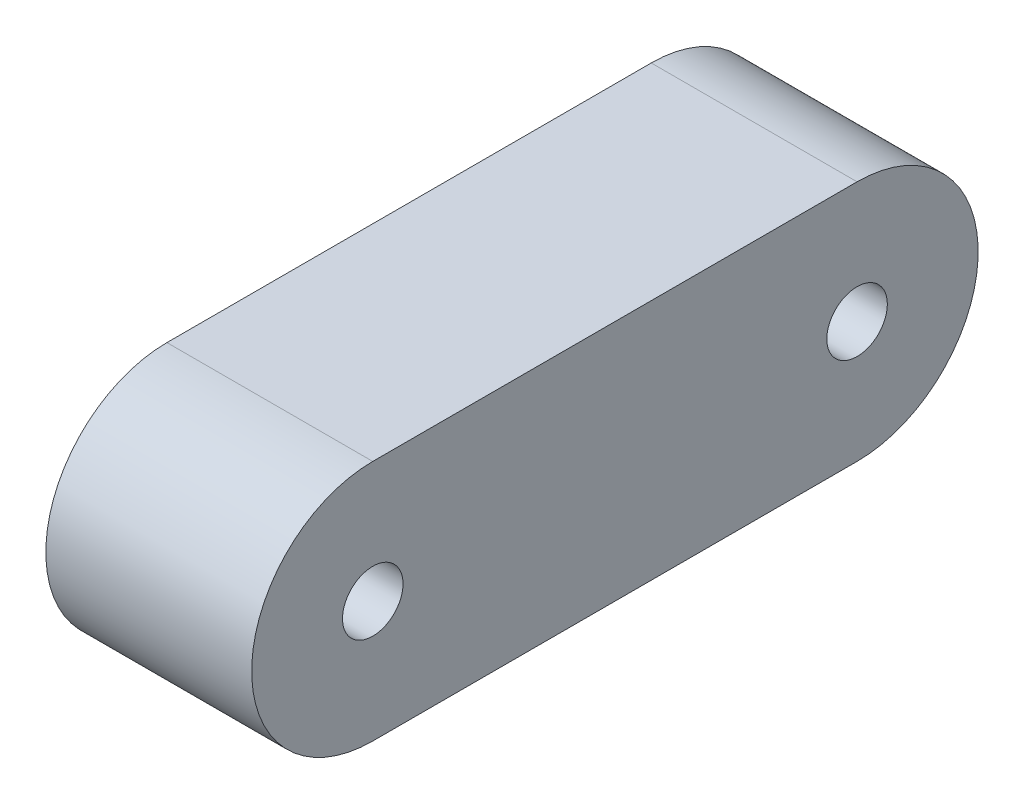
ISO-10303-21;
HEADER;
FILE_DESCRIPTION(('STEP AP214'),'2;1');
FILE_NAME('part.step','',(''),(''),'','','');
FILE_SCHEMA(('AUTOMOTIVE_DESIGN { 1 0 10303 214 1 1 1 1 }'));
ENDSEC;
DATA;
#1=APPLICATION_CONTEXT('core data for automotive mechanical design processes');
#2=APPLICATION_PROTOCOL_DEFINITION('international standard','automotive_design',2000,#1);
#3=PRODUCT_CONTEXT('',#1,'mechanical');
#4=PRODUCT('Part','Part','',(#3));
#5=PRODUCT_RELATED_PRODUCT_CATEGORY('part','',(#4));
#6=PRODUCT_DEFINITION_FORMATION('','',#4);
#7=PRODUCT_DEFINITION_CONTEXT('part definition',#1,'design');
#8=PRODUCT_DEFINITION('design','',#6,#7);
#9=PRODUCT_DEFINITION_SHAPE('','',#8);
#10=(LENGTH_UNIT() NAMED_UNIT(*) SI_UNIT(.MILLI.,.METRE.));
#11=(NAMED_UNIT(*) PLANE_ANGLE_UNIT() SI_UNIT($,.RADIAN.));
#12=(NAMED_UNIT(*) SI_UNIT($,.STERADIAN.) SOLID_ANGLE_UNIT());
#13=UNCERTAINTY_MEASURE_WITH_UNIT(LENGTH_MEASURE(1.E-05),#10,'distance_accuracy_value','');
#14=(GEOMETRIC_REPRESENTATION_CONTEXT(3) GLOBAL_UNCERTAINTY_ASSIGNED_CONTEXT((#13)) GLOBAL_UNIT_ASSIGNED_CONTEXT((#10,
#11,#12)) REPRESENTATION_CONTEXT('',''));
#15=CARTESIAN_POINT('',(0.,0.,0.));
#16=DIRECTION('',(0.,0.,1.));
#17=DIRECTION('',(1.,0.,0.));
#18=AXIS2_PLACEMENT_3D('',#15,#16,#17);
#19=CARTESIAN_POINT('',(8.5,0.,20.));
#20=DIRECTION('',(1.,0.,0.));
#21=DIRECTION('',(0.,0.,-1.));
#22=AXIS2_PLACEMENT_3D('',#19,#20,#21);
#23=PLANE('',#22);
#24=CARTESIAN_POINT('',(8.5,0.,20.));
#25=DIRECTION('',(1.,0.,0.));
#26=DIRECTION('',(0.,0.,-1.));
#27=AXIS2_PLACEMENT_3D('',#24,#25,#26);
#28=CIRCLE('',#27,2.5);
#29=CARTESIAN_POINT('',(8.5,0.,17.5));
#30=VERTEX_POINT('',#29);
#31=EDGE_CURVE('E100',#30,#30,#28,.T.);
#32=ORIENTED_EDGE('',*,*,#31,.F.);
#33=EDGE_LOOP('',(#32));
#34=FACE_BOUND('',#33,.T.);
#35=CARTESIAN_POINT('',(8.5,0.,20.));
#36=DIRECTION('',(1.,0.,0.));
#37=DIRECTION('',(0.,0.,-1.));
#38=AXIS2_PLACEMENT_3D('',#35,#36,#37);
#39=CIRCLE('',#38,9.99999999999999);
#40=CARTESIAN_POINT('',(8.5,9.99999999999998,20.));
#41=VERTEX_POINT('',#40);
#42=CARTESIAN_POINT('',(8.5,-9.99999999999999,20.));
#43=VERTEX_POINT('',#42);
#44=EDGE_CURVE('E85',#41,#43,#39,.T.);
#45=ORIENTED_EDGE('',*,*,#44,.T.);
#46=DIRECTION('',(0.,0.,-1.));
#47=VECTOR('',#46,1.);
#48=CARTESIAN_POINT('',(8.5,-9.99999999999999,20.));
#49=LINE('',#48,#47);
#50=CARTESIAN_POINT('',(8.5,-9.99999999999998,-20.));
#51=VERTEX_POINT('',#50);
#52=EDGE_CURVE('E80',#43,#51,#49,.T.);
#53=ORIENTED_EDGE('',*,*,#52,.T.);
#54=CARTESIAN_POINT('',(8.5,0.,-20.));
#55=DIRECTION('',(1.,0.,0.));
#56=DIRECTION('',(0.,0.,-1.));
#57=AXIS2_PLACEMENT_3D('',#54,#55,#56);
#58=CIRCLE('',#57,9.99999999999999);
#59=CARTESIAN_POINT('',(8.5,9.99999999999999,-20.));
#60=VERTEX_POINT('',#59);
#61=EDGE_CURVE('E83',#51,#60,#58,.T.);
#62=ORIENTED_EDGE('',*,*,#61,.T.);
#63=DIRECTION('',(0.,0.,1.));
#64=VECTOR('',#63,1.);
#65=CARTESIAN_POINT('',(8.5,9.99999999999998,20.));
#66=LINE('',#65,#64);
#67=EDGE_CURVE('E50',#60,#41,#66,.T.);
#68=ORIENTED_EDGE('',*,*,#67,.T.);
#69=EDGE_LOOP('',(#45,#53,#62,#68));
#70=FACE_BOUND('',#69,.T.);
#71=CARTESIAN_POINT('',(8.5,0.,-20.));
#72=DIRECTION('',(1.,0.,0.));
#73=DIRECTION('',(0.,0.,-1.));
#74=AXIS2_PLACEMENT_3D('',#71,#72,#73);
#75=CIRCLE('',#74,2.5);
#76=CARTESIAN_POINT('',(8.5,0.,-22.5));
#77=VERTEX_POINT('',#76);
#78=EDGE_CURVE('E115',#77,#77,#75,.T.);
#79=ORIENTED_EDGE('',*,*,#78,.F.);
#80=EDGE_LOOP('',(#79));
#81=FACE_BOUND('',#80,.T.);
#82=ADVANCED_FACE('F33',(#34,#70,#81),#23,.T.);
#83=CARTESIAN_POINT('',(-8.5,0.,20.));
#84=DIRECTION('',(1.,0.,0.));
#85=DIRECTION('',(0.,0.,-1.));
#86=AXIS2_PLACEMENT_3D('',#83,#84,#85);
#87=PLANE('',#86);
#88=CARTESIAN_POINT('',(-8.5,0.,20.));
#89=DIRECTION('',(1.,0.,0.));
#90=DIRECTION('',(0.,0.,-1.));
#91=AXIS2_PLACEMENT_3D('',#88,#89,#90);
#92=CIRCLE('',#91,9.99999999999999);
#93=CARTESIAN_POINT('',(-8.5,9.99999999999998,20.));
#94=VERTEX_POINT('',#93);
#95=CARTESIAN_POINT('',(-8.5,-9.99999999999999,20.));
#96=VERTEX_POINT('',#95);
#97=EDGE_CURVE('E97',#94,#96,#92,.T.);
#98=ORIENTED_EDGE('',*,*,#97,.F.);
#99=DIRECTION('',(0.,0.,1.));
#100=VECTOR('',#99,1.);
#101=CARTESIAN_POINT('',(-8.5,9.99999999999998,20.));
#102=LINE('',#101,#100);
#103=CARTESIAN_POINT('',(-8.5,9.99999999999999,-20.));
#104=VERTEX_POINT('',#103);
#105=EDGE_CURVE('E73',#104,#94,#102,.T.);
#106=ORIENTED_EDGE('',*,*,#105,.F.);
#107=CARTESIAN_POINT('',(-8.5,0.,-20.));
#108=DIRECTION('',(1.,0.,0.));
#109=DIRECTION('',(0.,0.,-1.));
#110=AXIS2_PLACEMENT_3D('',#107,#108,#109);
#111=CIRCLE('',#110,9.99999999999999);
#112=CARTESIAN_POINT('',(-8.5,-9.99999999999998,-20.));
#113=VERTEX_POINT('',#112);
#114=EDGE_CURVE('E67',#113,#104,#111,.T.);
#115=ORIENTED_EDGE('',*,*,#114,.F.);
#116=DIRECTION('',(0.,0.,-1.));
#117=VECTOR('',#116,1.);
#118=CARTESIAN_POINT('',(-8.5,-9.99999999999999,20.));
#119=LINE('',#118,#117);
#120=EDGE_CURVE('E89',#96,#113,#119,.T.);
#121=ORIENTED_EDGE('',*,*,#120,.F.);
#122=EDGE_LOOP('',(#98,#106,#115,#121));
#123=FACE_BOUND('',#122,.T.);
#124=CARTESIAN_POINT('',(-8.5,0.,20.));
#125=DIRECTION('',(1.,0.,0.));
#126=DIRECTION('',(0.,0.,-1.));
#127=AXIS2_PLACEMENT_3D('',#124,#125,#126);
#128=CIRCLE('',#127,2.5);
#129=CARTESIAN_POINT('',(-8.5,0.,17.5));
#130=VERTEX_POINT('',#129);
#131=EDGE_CURVE('E112',#130,#130,#128,.T.);
#132=ORIENTED_EDGE('',*,*,#131,.T.);
#133=EDGE_LOOP('',(#132));
#134=FACE_BOUND('',#133,.T.);
#135=CARTESIAN_POINT('',(-8.5,0.,-20.));
#136=DIRECTION('',(1.,0.,0.));
#137=DIRECTION('',(0.,0.,-1.));
#138=AXIS2_PLACEMENT_3D('',#135,#136,#137);
#139=CIRCLE('',#138,2.5);
#140=CARTESIAN_POINT('',(-8.5,0.,-22.5));
#141=VERTEX_POINT('',#140);
#142=EDGE_CURVE('E118',#141,#141,#139,.T.);
#143=ORIENTED_EDGE('',*,*,#142,.T.);
#144=EDGE_LOOP('',(#143));
#145=FACE_BOUND('',#144,.T.);
#146=ADVANCED_FACE('F108',(#123,#134,#145),#87,.F.);
#147=CARTESIAN_POINT('',(8.5,0.,20.));
#148=DIRECTION('',(-1.,0.,0.));
#149=DIRECTION('',(0.,0.,1.));
#150=AXIS2_PLACEMENT_3D('',#147,#148,#149);
#151=CYLINDRICAL_SURFACE('',#150,9.99999999999999);
#152=ORIENTED_EDGE('',*,*,#97,.T.);
#153=DIRECTION('',(-1.,0.,0.));
#154=VECTOR('',#153,1.);
#155=CARTESIAN_POINT('',(8.5,-9.99999999999999,20.));
#156=LINE('',#155,#154);
#157=EDGE_CURVE('E11',#43,#96,#156,.T.);
#158=ORIENTED_EDGE('',*,*,#157,.F.);
#159=ORIENTED_EDGE('',*,*,#44,.F.);
#160=DIRECTION('',(-1.,0.,0.));
#161=VECTOR('',#160,1.);
#162=CARTESIAN_POINT('',(8.5,9.99999999999998,20.));
#163=LINE('',#162,#161);
#164=EDGE_CURVE('E93',#41,#94,#163,.T.);
#165=ORIENTED_EDGE('',*,*,#164,.T.);
#166=EDGE_LOOP('',(#152,#158,#159,#165));
#167=FACE_BOUND('',#166,.T.);
#168=ADVANCED_FACE('F35',(#167),#151,.T.);
#169=CARTESIAN_POINT('',(8.5,-9.99999999999999,20.));
#170=DIRECTION('',(0.,1.,0.));
#171=DIRECTION('',(0.,0.,1.));
#172=AXIS2_PLACEMENT_3D('',#169,#170,#171);
#173=PLANE('',#172);
#174=ORIENTED_EDGE('',*,*,#120,.T.);
#175=DIRECTION('',(-1.,0.,0.));
#176=VECTOR('',#175,1.);
#177=CARTESIAN_POINT('',(8.5,-9.99999999999998,-20.));
#178=LINE('',#177,#176);
#179=EDGE_CURVE('E42',#51,#113,#178,.T.);
#180=ORIENTED_EDGE('',*,*,#179,.F.);
#181=ORIENTED_EDGE('',*,*,#52,.F.);
#182=ORIENTED_EDGE('',*,*,#157,.T.);
#183=EDGE_LOOP('',(#174,#180,#181,#182));
#184=FACE_BOUND('',#183,.T.);
#185=ADVANCED_FACE('F88',(#184),#173,.F.);
#186=CARTESIAN_POINT('',(8.5,0.,-20.));
#187=DIRECTION('',(-1.,0.,0.));
#188=DIRECTION('',(0.,0.,1.));
#189=AXIS2_PLACEMENT_3D('',#186,#187,#188);
#190=CYLINDRICAL_SURFACE('',#189,9.99999999999999);
#191=ORIENTED_EDGE('',*,*,#114,.T.);
#192=DIRECTION('',(-1.,0.,0.));
#193=VECTOR('',#192,1.);
#194=CARTESIAN_POINT('',(8.5,9.99999999999999,-20.));
#195=LINE('',#194,#193);
#196=EDGE_CURVE('E90',#60,#104,#195,.T.);
#197=ORIENTED_EDGE('',*,*,#196,.F.);
#198=ORIENTED_EDGE('',*,*,#61,.F.);
#199=ORIENTED_EDGE('',*,*,#179,.T.);
#200=EDGE_LOOP('',(#191,#197,#198,#199));
#201=FACE_BOUND('',#200,.T.);
#202=ADVANCED_FACE('F91',(#201),#190,.T.);
#203=CARTESIAN_POINT('',(8.5,9.99999999999998,20.));
#204=DIRECTION('',(0.,-1.,0.));
#205=DIRECTION('',(0.,0.,-1.));
#206=AXIS2_PLACEMENT_3D('',#203,#204,#205);
#207=PLANE('',#206);
#208=ORIENTED_EDGE('',*,*,#105,.T.);
#209=ORIENTED_EDGE('',*,*,#164,.F.);
#210=ORIENTED_EDGE('',*,*,#67,.F.);
#211=ORIENTED_EDGE('',*,*,#196,.T.);
#212=EDGE_LOOP('',(#208,#209,#210,#211));
#213=FACE_BOUND('',#212,.T.);
#214=ADVANCED_FACE('F105',(#213),#207,.F.);
#215=CARTESIAN_POINT('',(8.5,0.,20.));
#216=DIRECTION('',(-1.,0.,0.));
#217=DIRECTION('',(0.,0.,1.));
#218=AXIS2_PLACEMENT_3D('',#215,#216,#217);
#219=CYLINDRICAL_SURFACE('',#218,2.5);
#220=ORIENTED_EDGE('',*,*,#31,.T.);
#221=EDGE_LOOP('',(#220));
#222=FACE_BOUND('',#221,.T.);
#223=ORIENTED_EDGE('',*,*,#131,.F.);
#224=EDGE_LOOP('',(#223));
#225=FACE_BOUND('',#224,.T.);
#226=ADVANCED_FACE('F135',(#222,#225),#219,.F.);
#227=CARTESIAN_POINT('',(8.5,0.,-20.));
#228=DIRECTION('',(-1.,0.,0.));
#229=DIRECTION('',(0.,0.,1.));
#230=AXIS2_PLACEMENT_3D('',#227,#228,#229);
#231=CYLINDRICAL_SURFACE('',#230,2.5);
#232=ORIENTED_EDGE('',*,*,#78,.T.);
#233=EDGE_LOOP('',(#232));
#234=FACE_BOUND('',#233,.T.);
#235=ORIENTED_EDGE('',*,*,#142,.F.);
#236=EDGE_LOOP('',(#235));
#237=FACE_BOUND('',#236,.T.);
#238=ADVANCED_FACE('F124',(#234,#237),#231,.F.);
#239=CLOSED_SHELL('',(#82,#146,#168,#185,#202,#214,#226,#238));
#240=MANIFOLD_SOLID_BREP('B2',#239);
#241=ADVANCED_BREP_SHAPE_REPRESENTATION('',(#18,#240),#14);
#242=SHAPE_DEFINITION_REPRESENTATION(#9,#241);
ENDSEC;
END-ISO-10303-21;
